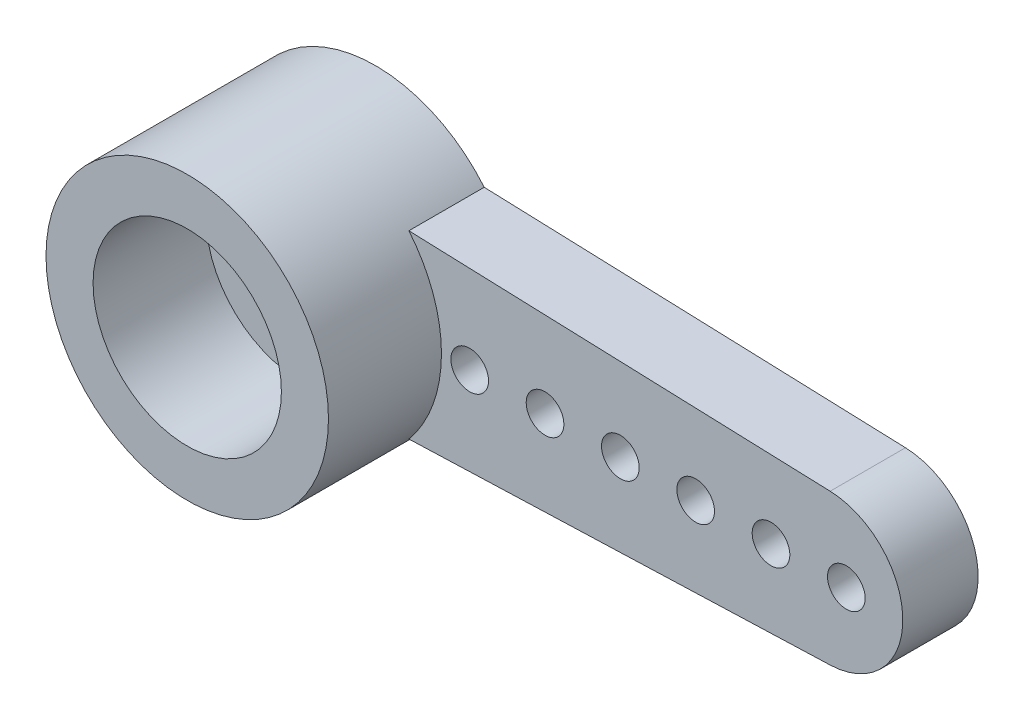
ISO-10303-21;
HEADER;
FILE_DESCRIPTION(('STEP AP214'),'2;1');
FILE_NAME('part.step','',(''),(''),'','','');
FILE_SCHEMA(('AUTOMOTIVE_DESIGN { 1 0 10303 214 1 1 1 1 }'));
ENDSEC;
DATA;
#1=APPLICATION_CONTEXT('core data for automotive mechanical design processes');
#2=APPLICATION_PROTOCOL_DEFINITION('international standard','automotive_design',2000,#1);
#3=PRODUCT_CONTEXT('',#1,'mechanical');
#4=PRODUCT('Part','Part','',(#3));
#5=PRODUCT_RELATED_PRODUCT_CATEGORY('part','',(#4));
#6=PRODUCT_DEFINITION_FORMATION('','',#4);
#7=PRODUCT_DEFINITION_CONTEXT('part definition',#1,'design');
#8=PRODUCT_DEFINITION('design','',#6,#7);
#9=PRODUCT_DEFINITION_SHAPE('','',#8);
#10=(LENGTH_UNIT() NAMED_UNIT(*) SI_UNIT(.MILLI.,.METRE.));
#11=(NAMED_UNIT(*) PLANE_ANGLE_UNIT() SI_UNIT($,.RADIAN.));
#12=(NAMED_UNIT(*) SI_UNIT($,.STERADIAN.) SOLID_ANGLE_UNIT());
#13=UNCERTAINTY_MEASURE_WITH_UNIT(LENGTH_MEASURE(1.E-05),#10,'distance_accuracy_value','');
#14=(GEOMETRIC_REPRESENTATION_CONTEXT(3) GLOBAL_UNCERTAINTY_ASSIGNED_CONTEXT((#13)) GLOBAL_UNIT_ASSIGNED_CONTEXT((#10,
#11,#12)) REPRESENTATION_CONTEXT('',''));
#15=CARTESIAN_POINT('',(0.,0.,0.));
#16=DIRECTION('',(0.,0.,1.));
#17=DIRECTION('',(1.,0.,0.));
#18=AXIS2_PLACEMENT_3D('',#15,#16,#17);
#19=CARTESIAN_POINT('',(0.,0.,-10.6066017177982));
#20=DIRECTION('',(0.,0.,1.));
#21=DIRECTION('',(1.,0.,0.));
#22=AXIS2_PLACEMENT_3D('',#19,#20,#21);
#23=CYLINDRICAL_SURFACE('',#22,3.75);
#24=CARTESIAN_POINT('',(0.,0.,0.));
#25=DIRECTION('',(0.,0.,-1.));
#26=DIRECTION('',(-1.,0.,0.));
#27=AXIS2_PLACEMENT_3D('',#24,#25,#26);
#28=CIRCLE('',#27,3.75);
#29=CARTESIAN_POINT('',(2.88547071027724,-2.39511143376089,0.));
#30=VERTEX_POINT('',#29);
#31=CARTESIAN_POINT('',(2.88547071027724,2.39511143376089,0.));
#32=VERTEX_POINT('',#31);
#33=EDGE_CURVE('E51',#30,#32,#28,.T.);
#34=ORIENTED_EDGE('',*,*,#33,.F.);
#35=DIRECTION('',(0.,0.,-1.));
#36=VECTOR('',#35,1.);
#37=CARTESIAN_POINT('',(2.88547071027724,-2.39511143376089,2.));
#38=LINE('',#37,#36);
#39=CARTESIAN_POINT('',(2.88547071027724,-2.39511143376089,2.));
#40=VERTEX_POINT('',#39);
#41=EDGE_CURVE('E108',#40,#30,#38,.T.);
#42=ORIENTED_EDGE('',*,*,#41,.F.);
#43=CARTESIAN_POINT('',(0.,0.,2.));
#44=DIRECTION('',(0.,0.,1.));
#45=DIRECTION('',(1.,0.,0.));
#46=AXIS2_PLACEMENT_3D('',#43,#44,#45);
#47=CIRCLE('',#46,3.75);
#48=CARTESIAN_POINT('',(2.88547071027724,2.39511143376089,2.));
#49=VERTEX_POINT('',#48);
#50=EDGE_CURVE('E106',#40,#49,#47,.T.);
#51=ORIENTED_EDGE('',*,*,#50,.T.);
#52=DIRECTION('',(0.,0.,-1.));
#53=VECTOR('',#52,1.);
#54=CARTESIAN_POINT('',(2.88547071027724,2.39511143376089,2.));
#55=LINE('',#54,#53);
#56=EDGE_CURVE('E102',#49,#32,#55,.T.);
#57=ORIENTED_EDGE('',*,*,#56,.T.);
#58=EDGE_LOOP('',(#34,#42,#51,#57));
#59=FACE_BOUND('',#58,.T.);
#60=CARTESIAN_POINT('',(0.,0.,5.));
#61=DIRECTION('',(0.,0.,1.));
#62=DIRECTION('',(1.,0.,0.));
#63=AXIS2_PLACEMENT_3D('',#60,#61,#62);
#64=CIRCLE('',#63,3.75);
#65=CARTESIAN_POINT('',(3.75,0.,5.));
#66=VERTEX_POINT('',#65);
#67=EDGE_CURVE('E122',#66,#66,#64,.T.);
#68=ORIENTED_EDGE('',*,*,#67,.F.);
#69=EDGE_LOOP('',(#68));
#70=FACE_BOUND('',#69,.T.);
#71=ADVANCED_FACE('F43',(#59,#70),#23,.T.);
#72=CARTESIAN_POINT('',(0.,0.,0.));
#73=DIRECTION('',(0.,0.,1.));
#74=DIRECTION('',(1.,0.,0.));
#75=AXIS2_PLACEMENT_3D('',#72,#73,#74);
#76=PLANE('',#75);
#77=ORIENTED_EDGE('',*,*,#33,.T.);
#78=DIRECTION('',(-0.999372730394994,0.0354139201848023,0.));
#79=VECTOR('',#78,1.);
#80=CARTESIAN_POINT('',(0.0883858807695825,2.49422934631706,0.));
#81=LINE('',#80,#79);
#82=CARTESIAN_POINT('',(14.0708278403696,1.99874546078999,0.));
#83=VERTEX_POINT('',#82);
#84=EDGE_CURVE('E85',#83,#32,#81,.T.);
#85=ORIENTED_EDGE('',*,*,#84,.F.);
#86=CARTESIAN_POINT('',(14.,0.,0.));
#87=DIRECTION('',(0.,0.,1.));
#88=DIRECTION('',(1.,0.,0.));
#89=AXIS2_PLACEMENT_3D('',#86,#87,#88);
#90=CIRCLE('',#89,2.);
#91=CARTESIAN_POINT('',(14.0708278403696,-1.99874546078998,0.));
#92=VERTEX_POINT('',#91);
#93=EDGE_CURVE('E101',#92,#83,#90,.T.);
#94=ORIENTED_EDGE('',*,*,#93,.F.);
#95=DIRECTION('',(-0.999372730394994,-0.0354139201848029,0.));
#96=VECTOR('',#95,1.);
#97=CARTESIAN_POINT('',(0.0883858807695838,-2.49422934631706,0.));
#98=LINE('',#97,#96);
#99=EDGE_CURVE('E58',#92,#30,#98,.T.);
#100=ORIENTED_EDGE('',*,*,#99,.T.);
#101=EDGE_LOOP('',(#77,#85,#94,#100));
#102=FACE_BOUND('',#101,.T.);
#103=CARTESIAN_POINT('',(12.5,0.,0.));
#104=DIRECTION('',(0.,0.,-1.));
#105=DIRECTION('',(-1.,0.,0.));
#106=AXIS2_PLACEMENT_3D('',#103,#104,#105);
#107=CIRCLE('',#106,0.500000000000001);
#108=CARTESIAN_POINT('',(12.,0.,0.));
#109=VERTEX_POINT('',#108);
#110=EDGE_CURVE('E289',#109,#109,#107,.T.);
#111=ORIENTED_EDGE('',*,*,#110,.F.);
#112=EDGE_LOOP('',(#111));
#113=FACE_BOUND('',#112,.T.);
#114=CARTESIAN_POINT('',(4.5,0.,0.));
#115=DIRECTION('',(0.,0.,-1.));
#116=DIRECTION('',(-1.,0.,0.));
#117=AXIS2_PLACEMENT_3D('',#114,#115,#116);
#118=CIRCLE('',#117,0.500000000000001);
#119=CARTESIAN_POINT('',(4.,0.,0.));
#120=VERTEX_POINT('',#119);
#121=EDGE_CURVE('E293',#120,#120,#118,.T.);
#122=ORIENTED_EDGE('',*,*,#121,.F.);
#123=EDGE_LOOP('',(#122));
#124=FACE_BOUND('',#123,.T.);
#125=CARTESIAN_POINT('',(6.5,0.,0.));
#126=DIRECTION('',(0.,0.,-1.));
#127=DIRECTION('',(-1.,0.,0.));
#128=AXIS2_PLACEMENT_3D('',#125,#126,#127);
#129=CIRCLE('',#128,0.500000000000001);
#130=CARTESIAN_POINT('',(6.,0.,0.));
#131=VERTEX_POINT('',#130);
#132=EDGE_CURVE('E300',#131,#131,#129,.T.);
#133=ORIENTED_EDGE('',*,*,#132,.F.);
#134=EDGE_LOOP('',(#133));
#135=FACE_BOUND('',#134,.T.);
#136=CARTESIAN_POINT('',(8.5,0.,0.));
#137=DIRECTION('',(0.,0.,-1.));
#138=DIRECTION('',(-1.,0.,0.));
#139=AXIS2_PLACEMENT_3D('',#136,#137,#138);
#140=CIRCLE('',#139,0.500000000000001);
#141=CARTESIAN_POINT('',(8.,0.,0.));
#142=VERTEX_POINT('',#141);
#143=EDGE_CURVE('E306',#142,#142,#140,.T.);
#144=ORIENTED_EDGE('',*,*,#143,.F.);
#145=EDGE_LOOP('',(#144));
#146=FACE_BOUND('',#145,.T.);
#147=CARTESIAN_POINT('',(10.5,0.,0.));
#148=DIRECTION('',(0.,0.,-1.));
#149=DIRECTION('',(-1.,0.,0.));
#150=AXIS2_PLACEMENT_3D('',#147,#148,#149);
#151=CIRCLE('',#150,0.500000000000001);
#152=CARTESIAN_POINT('',(10.,0.,0.));
#153=VERTEX_POINT('',#152);
#154=EDGE_CURVE('E312',#153,#153,#151,.T.);
#155=ORIENTED_EDGE('',*,*,#154,.F.);
#156=EDGE_LOOP('',(#155));
#157=FACE_BOUND('',#156,.T.);
#158=CARTESIAN_POINT('',(14.5,0.,0.));
#159=DIRECTION('',(0.,0.,-1.));
#160=DIRECTION('',(-1.,0.,0.));
#161=AXIS2_PLACEMENT_3D('',#158,#159,#160);
#162=CIRCLE('',#161,0.500000000000001);
#163=CARTESIAN_POINT('',(14.,0.,0.));
#164=VERTEX_POINT('',#163);
#165=EDGE_CURVE('E315',#164,#164,#162,.T.);
#166=ORIENTED_EDGE('',*,*,#165,.F.);
#167=EDGE_LOOP('',(#166));
#168=FACE_BOUND('',#167,.T.);
#169=ADVANCED_FACE('F45',(#102,#113,#124,#135,#146,#157,#168),#76,.F.);
#170=CARTESIAN_POINT('',(0.,0.,5.));
#171=DIRECTION('',(0.,0.,1.));
#172=DIRECTION('',(1.,0.,0.));
#173=AXIS2_PLACEMENT_3D('',#170,#171,#172);
#174=PLANE('',#173);
#175=ORIENTED_EDGE('',*,*,#67,.T.);
#176=EDGE_LOOP('',(#175));
#177=FACE_BOUND('',#176,.T.);
#178=CARTESIAN_POINT('',(0.,0.,5.));
#179=DIRECTION('',(0.,0.,1.));
#180=DIRECTION('',(1.,0.,0.));
#181=AXIS2_PLACEMENT_3D('',#178,#179,#180);
#182=CIRCLE('',#181,2.5);
#183=CARTESIAN_POINT('',(2.5,0.,5.));
#184=VERTEX_POINT('',#183);
#185=EDGE_CURVE('E119',#184,#184,#182,.T.);
#186=ORIENTED_EDGE('',*,*,#185,.F.);
#187=EDGE_LOOP('',(#186));
#188=FACE_BOUND('',#187,.T.);
#189=ADVANCED_FACE('F146',(#177,#188),#174,.T.);
#190=CARTESIAN_POINT('',(0.,0.,5.));
#191=DIRECTION('',(0.,0.,-1.));
#192=DIRECTION('',(-1.,0.,0.));
#193=AXIS2_PLACEMENT_3D('',#190,#191,#192);
#194=CYLINDRICAL_SURFACE('',#193,2.5);
#195=ORIENTED_EDGE('',*,*,#185,.T.);
#196=EDGE_LOOP('',(#195));
#197=FACE_BOUND('',#196,.T.);
#198=CARTESIAN_POINT('',(0.,0.,2.));
#199=DIRECTION('',(0.,0.,1.));
#200=DIRECTION('',(1.,0.,0.));
#201=AXIS2_PLACEMENT_3D('',#198,#199,#200);
#202=CIRCLE('',#201,2.5);
#203=CARTESIAN_POINT('',(2.5,0.,2.));
#204=VERTEX_POINT('',#203);
#205=EDGE_CURVE('E12',#204,#204,#202,.F.);
#206=ORIENTED_EDGE('',*,*,#205,.T.);
#207=EDGE_LOOP('',(#206));
#208=FACE_BOUND('',#207,.T.);
#209=ADVANCED_FACE('F138',(#197,#208),#194,.F.);
#210=CARTESIAN_POINT('',(0.,0.,2.));
#211=DIRECTION('',(0.,0.,1.));
#212=DIRECTION('',(1.,0.,0.));
#213=AXIS2_PLACEMENT_3D('',#210,#211,#212);
#214=PLANE('',#213);
#215=ORIENTED_EDGE('',*,*,#205,.F.);
#216=EDGE_LOOP('',(#215));
#217=FACE_BOUND('',#216,.T.);
#218=ADVANCED_FACE('F131',(#217),#214,.T.);
#219=CARTESIAN_POINT('',(0.0883858807695838,-2.49422934631706,2.));
#220=DIRECTION('',(0.0354139201848029,-0.999372730394994,0.));
#221=DIRECTION('',(0.999372730394994,0.0354139201848029,0.));
#222=AXIS2_PLACEMENT_3D('',#219,#220,#221);
#223=PLANE('',#222);
#224=ORIENTED_EDGE('',*,*,#99,.F.);
#225=DIRECTION('',(0.,0.,-1.));
#226=VECTOR('',#225,1.);
#227=CARTESIAN_POINT('',(14.0708278403696,-1.99874546078998,2.));
#228=LINE('',#227,#226);
#229=CARTESIAN_POINT('',(14.0708278403696,-1.99874546078998,2.));
#230=VERTEX_POINT('',#229);
#231=EDGE_CURVE('E88',#230,#92,#228,.T.);
#232=ORIENTED_EDGE('',*,*,#231,.F.);
#233=DIRECTION('',(-0.999372730394994,-0.0354139201848029,0.));
#234=VECTOR('',#233,1.);
#235=CARTESIAN_POINT('',(0.0883858807695838,-2.49422934631706,2.));
#236=LINE('',#235,#234);
#237=EDGE_CURVE('E66',#230,#40,#236,.T.);
#238=ORIENTED_EDGE('',*,*,#237,.T.);
#239=ORIENTED_EDGE('',*,*,#41,.T.);
#240=EDGE_LOOP('',(#224,#232,#238,#239));
#241=FACE_BOUND('',#240,.T.);
#242=ADVANCED_FACE('F129',(#241),#223,.T.);
#243=CARTESIAN_POINT('',(14.,0.,2.));
#244=DIRECTION('',(0.,0.,-1.));
#245=DIRECTION('',(-1.,0.,0.));
#246=AXIS2_PLACEMENT_3D('',#243,#244,#245);
#247=CYLINDRICAL_SURFACE('',#246,2.);
#248=ORIENTED_EDGE('',*,*,#93,.T.);
#249=DIRECTION('',(0.,0.,-1.));
#250=VECTOR('',#249,1.);
#251=CARTESIAN_POINT('',(14.0708278403696,1.99874546078999,2.));
#252=LINE('',#251,#250);
#253=CARTESIAN_POINT('',(14.0708278403696,1.99874546078999,2.));
#254=VERTEX_POINT('',#253);
#255=EDGE_CURVE('E99',#254,#83,#252,.T.);
#256=ORIENTED_EDGE('',*,*,#255,.F.);
#257=CARTESIAN_POINT('',(14.,0.,2.));
#258=DIRECTION('',(0.,0.,1.));
#259=DIRECTION('',(1.,0.,0.));
#260=AXIS2_PLACEMENT_3D('',#257,#258,#259);
#261=CIRCLE('',#260,2.);
#262=EDGE_CURVE('E92',#230,#254,#261,.T.);
#263=ORIENTED_EDGE('',*,*,#262,.F.);
#264=ORIENTED_EDGE('',*,*,#231,.T.);
#265=EDGE_LOOP('',(#248,#256,#263,#264));
#266=FACE_BOUND('',#265,.T.);
#267=ADVANCED_FACE('F100',(#266),#247,.T.);
#268=CARTESIAN_POINT('',(0.0883858807695825,2.49422934631706,2.));
#269=DIRECTION('',(-0.0354139201848023,-0.999372730394994,0.));
#270=DIRECTION('',(0.999372730394994,-0.0354139201848023,0.));
#271=AXIS2_PLACEMENT_3D('',#268,#269,#270);
#272=PLANE('',#271);
#273=ORIENTED_EDGE('',*,*,#84,.T.);
#274=ORIENTED_EDGE('',*,*,#56,.F.);
#275=DIRECTION('',(-0.999372730394994,0.0354139201848023,0.));
#276=VECTOR('',#275,1.);
#277=CARTESIAN_POINT('',(0.0883858807695825,2.49422934631706,2.));
#278=LINE('',#277,#276);
#279=EDGE_CURVE('E96',#254,#49,#278,.T.);
#280=ORIENTED_EDGE('',*,*,#279,.F.);
#281=ORIENTED_EDGE('',*,*,#255,.T.);
#282=EDGE_LOOP('',(#273,#274,#280,#281));
#283=FACE_BOUND('',#282,.T.);
#284=ADVANCED_FACE('F104',(#283),#272,.F.);
#285=CARTESIAN_POINT('',(0.,0.,2.));
#286=DIRECTION('',(0.,0.,1.));
#287=DIRECTION('',(1.,0.,0.));
#288=AXIS2_PLACEMENT_3D('',#285,#286,#287);
#289=PLANE('',#288);
#290=CARTESIAN_POINT('',(12.5,0.,2.));
#291=DIRECTION('',(0.,0.,-1.));
#292=DIRECTION('',(-1.,0.,0.));
#293=AXIS2_PLACEMENT_3D('',#290,#291,#292);
#294=CIRCLE('',#293,0.500000000000001);
#295=CARTESIAN_POINT('',(12.,0.,2.));
#296=VERTEX_POINT('',#295);
#297=EDGE_CURVE('E286',#296,#296,#294,.T.);
#298=ORIENTED_EDGE('',*,*,#297,.T.);
#299=EDGE_LOOP('',(#298));
#300=FACE_BOUND('',#299,.T.);
#301=CARTESIAN_POINT('',(4.5,0.,2.));
#302=DIRECTION('',(0.,0.,-1.));
#303=DIRECTION('',(-1.,0.,0.));
#304=AXIS2_PLACEMENT_3D('',#301,#302,#303);
#305=CIRCLE('',#304,0.500000000000001);
#306=CARTESIAN_POINT('',(4.,0.,2.));
#307=VERTEX_POINT('',#306);
#308=EDGE_CURVE('E290',#307,#307,#305,.T.);
#309=ORIENTED_EDGE('',*,*,#308,.T.);
#310=EDGE_LOOP('',(#309));
#311=FACE_BOUND('',#310,.T.);
#312=CARTESIAN_POINT('',(6.5,0.,2.));
#313=DIRECTION('',(0.,0.,-1.));
#314=DIRECTION('',(-1.,0.,0.));
#315=AXIS2_PLACEMENT_3D('',#312,#313,#314);
#316=CIRCLE('',#315,0.500000000000001);
#317=CARTESIAN_POINT('',(6.,0.,2.));
#318=VERTEX_POINT('',#317);
#319=EDGE_CURVE('E298',#318,#318,#316,.T.);
#320=ORIENTED_EDGE('',*,*,#319,.T.);
#321=EDGE_LOOP('',(#320));
#322=FACE_BOUND('',#321,.T.);
#323=CARTESIAN_POINT('',(8.5,0.,2.));
#324=DIRECTION('',(0.,0.,-1.));
#325=DIRECTION('',(-1.,0.,0.));
#326=AXIS2_PLACEMENT_3D('',#323,#324,#325);
#327=CIRCLE('',#326,0.500000000000001);
#328=CARTESIAN_POINT('',(8.,0.,2.));
#329=VERTEX_POINT('',#328);
#330=EDGE_CURVE('E303',#329,#329,#327,.T.);
#331=ORIENTED_EDGE('',*,*,#330,.T.);
#332=EDGE_LOOP('',(#331));
#333=FACE_BOUND('',#332,.T.);
#334=CARTESIAN_POINT('',(10.5,0.,2.));
#335=DIRECTION('',(0.,0.,-1.));
#336=DIRECTION('',(-1.,0.,0.));
#337=AXIS2_PLACEMENT_3D('',#334,#335,#336);
#338=CIRCLE('',#337,0.500000000000001);
#339=CARTESIAN_POINT('',(10.,0.,2.));
#340=VERTEX_POINT('',#339);
#341=EDGE_CURVE('E309',#340,#340,#338,.T.);
#342=ORIENTED_EDGE('',*,*,#341,.T.);
#343=EDGE_LOOP('',(#342));
#344=FACE_BOUND('',#343,.T.);
#345=CARTESIAN_POINT('',(14.5,0.,2.));
#346=DIRECTION('',(0.,0.,-1.));
#347=DIRECTION('',(-1.,0.,0.));
#348=AXIS2_PLACEMENT_3D('',#345,#346,#347);
#349=CIRCLE('',#348,0.500000000000001);
#350=CARTESIAN_POINT('',(14.,0.,2.));
#351=VERTEX_POINT('',#350);
#352=EDGE_CURVE('E113',#351,#351,#349,.T.);
#353=ORIENTED_EDGE('',*,*,#352,.T.);
#354=EDGE_LOOP('',(#353));
#355=FACE_BOUND('',#354,.T.);
#356=ORIENTED_EDGE('',*,*,#237,.F.);
#357=ORIENTED_EDGE('',*,*,#262,.T.);
#358=ORIENTED_EDGE('',*,*,#279,.T.);
#359=ORIENTED_EDGE('',*,*,#50,.F.);
#360=EDGE_LOOP('',(#356,#357,#358,#359));
#361=FACE_BOUND('',#360,.T.);
#362=ADVANCED_FACE('F94',(#300,#311,#322,#333,#344,#355,#361),#289,.T.);
#363=CARTESIAN_POINT('',(14.5,0.,2.));
#364=DIRECTION('',(0.,0.,-1.));
#365=DIRECTION('',(-1.,0.,0.));
#366=AXIS2_PLACEMENT_3D('',#363,#364,#365);
#367=CYLINDRICAL_SURFACE('',#366,0.500000000000001);
#368=ORIENTED_EDGE('',*,*,#352,.F.);
#369=EDGE_LOOP('',(#368));
#370=FACE_BOUND('',#369,.T.);
#371=ORIENTED_EDGE('',*,*,#165,.T.);
#372=EDGE_LOOP('',(#371));
#373=FACE_BOUND('',#372,.T.);
#374=ADVANCED_FACE('F194',(#370,#373),#367,.F.);
#375=CARTESIAN_POINT('',(10.5,0.,2.));
#376=DIRECTION('',(0.,0.,-1.));
#377=DIRECTION('',(-1.,0.,0.));
#378=AXIS2_PLACEMENT_3D('',#375,#376,#377);
#379=CYLINDRICAL_SURFACE('',#378,0.500000000000001);
#380=ORIENTED_EDGE('',*,*,#341,.F.);
#381=EDGE_LOOP('',(#380));
#382=FACE_BOUND('',#381,.T.);
#383=ORIENTED_EDGE('',*,*,#154,.T.);
#384=EDGE_LOOP('',(#383));
#385=FACE_BOUND('',#384,.T.);
#386=ADVANCED_FACE('F204',(#382,#385),#379,.F.);
#387=CARTESIAN_POINT('',(8.5,0.,2.));
#388=DIRECTION('',(0.,0.,-1.));
#389=DIRECTION('',(-1.,0.,0.));
#390=AXIS2_PLACEMENT_3D('',#387,#388,#389);
#391=CYLINDRICAL_SURFACE('',#390,0.500000000000001);
#392=ORIENTED_EDGE('',*,*,#330,.F.);
#393=EDGE_LOOP('',(#392));
#394=FACE_BOUND('',#393,.T.);
#395=ORIENTED_EDGE('',*,*,#143,.T.);
#396=EDGE_LOOP('',(#395));
#397=FACE_BOUND('',#396,.T.);
#398=ADVANCED_FACE('F214',(#394,#397),#391,.F.);
#399=CARTESIAN_POINT('',(6.5,0.,2.));
#400=DIRECTION('',(0.,0.,-1.));
#401=DIRECTION('',(-1.,0.,0.));
#402=AXIS2_PLACEMENT_3D('',#399,#400,#401);
#403=CYLINDRICAL_SURFACE('',#402,0.500000000000001);
#404=ORIENTED_EDGE('',*,*,#319,.F.);
#405=EDGE_LOOP('',(#404));
#406=FACE_BOUND('',#405,.T.);
#407=ORIENTED_EDGE('',*,*,#132,.T.);
#408=EDGE_LOOP('',(#407));
#409=FACE_BOUND('',#408,.T.);
#410=ADVANCED_FACE('F224',(#406,#409),#403,.F.);
#411=CARTESIAN_POINT('',(4.5,0.,2.));
#412=DIRECTION('',(0.,0.,-1.));
#413=DIRECTION('',(-1.,0.,0.));
#414=AXIS2_PLACEMENT_3D('',#411,#412,#413);
#415=CYLINDRICAL_SURFACE('',#414,0.500000000000001);
#416=ORIENTED_EDGE('',*,*,#308,.F.);
#417=EDGE_LOOP('',(#416));
#418=FACE_BOUND('',#417,.T.);
#419=ORIENTED_EDGE('',*,*,#121,.T.);
#420=EDGE_LOOP('',(#419));
#421=FACE_BOUND('',#420,.T.);
#422=ADVANCED_FACE('F234',(#418,#421),#415,.F.);
#423=CARTESIAN_POINT('',(12.5,0.,2.));
#424=DIRECTION('',(0.,0.,-1.));
#425=DIRECTION('',(-1.,0.,0.));
#426=AXIS2_PLACEMENT_3D('',#423,#424,#425);
#427=CYLINDRICAL_SURFACE('',#426,0.500000000000001);
#428=ORIENTED_EDGE('',*,*,#297,.F.);
#429=EDGE_LOOP('',(#428));
#430=FACE_BOUND('',#429,.T.);
#431=ORIENTED_EDGE('',*,*,#110,.T.);
#432=EDGE_LOOP('',(#431));
#433=FACE_BOUND('',#432,.T.);
#434=ADVANCED_FACE('F244',(#430,#433),#427,.F.);
#435=CLOSED_SHELL('',(#71,#169,#189,#209,#218,#242,#267,#284,#362,#374,#386,#398,#410,#422,#434));
#436=MANIFOLD_SOLID_BREP('B2',#435);
#437=ADVANCED_BREP_SHAPE_REPRESENTATION('',(#18,#436),#14);
#438=SHAPE_DEFINITION_REPRESENTATION(#9,#437);
ENDSEC;
END-ISO-10303-21;
